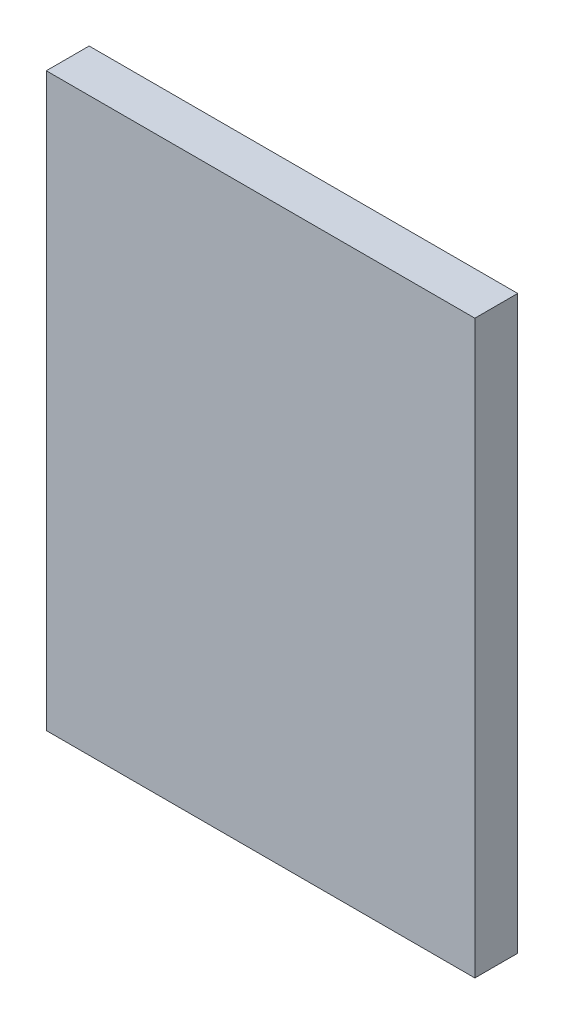
ISO-10303-21;
HEADER;
FILE_DESCRIPTION(('STEP AP214'),'2;1');
FILE_NAME('part.step','',(''),(''),'','','');
FILE_SCHEMA(('AUTOMOTIVE_DESIGN { 1 0 10303 214 1 1 1 1 }'));
ENDSEC;
DATA;
#1=APPLICATION_CONTEXT('core data for automotive mechanical design processes');
#2=APPLICATION_PROTOCOL_DEFINITION('international standard','automotive_design',2000,#1);
#3=PRODUCT_CONTEXT('',#1,'mechanical');
#4=PRODUCT('Part','Part','',(#3));
#5=PRODUCT_RELATED_PRODUCT_CATEGORY('part','',(#4));
#6=PRODUCT_DEFINITION_FORMATION('','',#4);
#7=PRODUCT_DEFINITION_CONTEXT('part definition',#1,'design');
#8=PRODUCT_DEFINITION('design','',#6,#7);
#9=PRODUCT_DEFINITION_SHAPE('','',#8);
#10=(LENGTH_UNIT() NAMED_UNIT(*) SI_UNIT(.MILLI.,.METRE.));
#11=(NAMED_UNIT(*) PLANE_ANGLE_UNIT() SI_UNIT($,.RADIAN.));
#12=(NAMED_UNIT(*) SI_UNIT($,.STERADIAN.) SOLID_ANGLE_UNIT());
#13=UNCERTAINTY_MEASURE_WITH_UNIT(LENGTH_MEASURE(1.E-05),#10,'distance_accuracy_value','');
#14=(GEOMETRIC_REPRESENTATION_CONTEXT(3) GLOBAL_UNCERTAINTY_ASSIGNED_CONTEXT((#13)) GLOBAL_UNIT_ASSIGNED_CONTEXT((#10,
#11,#12)) REPRESENTATION_CONTEXT('',''));
#15=CARTESIAN_POINT('',(0.,0.,0.));
#16=DIRECTION('',(0.,0.,1.));
#17=DIRECTION('',(1.,0.,0.));
#18=AXIS2_PLACEMENT_3D('',#15,#16,#17);
#19=CARTESIAN_POINT('',(0.,0.,30.));
#20=DIRECTION('',(1.,0.,0.));
#21=DIRECTION('',(0.,1.,0.));
#22=AXIS2_PLACEMENT_3D('',#19,#20,#21);
#23=PLANE('',#22);
#24=DIRECTION('',(0.,-1.,0.));
#25=VECTOR('',#24,1.);
#26=CARTESIAN_POINT('',(0.,0.,0.));
#27=LINE('',#26,#25);
#28=CARTESIAN_POINT('',(0.,0.,0.));
#29=VERTEX_POINT('',#28);
#30=CARTESIAN_POINT('',(0.,-400.,0.));
#31=VERTEX_POINT('',#30);
#32=EDGE_CURVE('E96',#29,#31,#27,.T.);
#33=ORIENTED_EDGE('',*,*,#32,.T.);
#34=DIRECTION('',(0.,0.,-1.));
#35=VECTOR('',#34,1.);
#36=CARTESIAN_POINT('',(0.,-400.,30.));
#37=LINE('',#36,#35);
#38=CARTESIAN_POINT('',(0.,-400.,30.));
#39=VERTEX_POINT('',#38);
#40=EDGE_CURVE('E11',#39,#31,#37,.T.);
#41=ORIENTED_EDGE('',*,*,#40,.F.);
#42=DIRECTION('',(0.,-1.,0.));
#43=VECTOR('',#42,1.);
#44=CARTESIAN_POINT('',(0.,0.,30.));
#45=LINE('',#44,#43);
#46=CARTESIAN_POINT('',(0.,0.,30.));
#47=VERTEX_POINT('',#46);
#48=EDGE_CURVE('E84',#47,#39,#45,.T.);
#49=ORIENTED_EDGE('',*,*,#48,.F.);
#50=DIRECTION('',(0.,0.,-1.));
#51=VECTOR('',#50,1.);
#52=CARTESIAN_POINT('',(0.,0.,30.));
#53=LINE('',#52,#51);
#54=EDGE_CURVE('E92',#47,#29,#53,.T.);
#55=ORIENTED_EDGE('',*,*,#54,.T.);
#56=EDGE_LOOP('',(#33,#41,#49,#55));
#57=FACE_BOUND('',#56,.T.);
#58=ADVANCED_FACE('F33',(#57),#23,.F.);
#59=CARTESIAN_POINT('',(0.,-400.,30.));
#60=DIRECTION('',(0.,1.,0.));
#61=DIRECTION('',(0.,0.,1.));
#62=AXIS2_PLACEMENT_3D('',#59,#60,#61);
#63=PLANE('',#62);
#64=DIRECTION('',(1.,0.,0.));
#65=VECTOR('',#64,1.);
#66=CARTESIAN_POINT('',(0.,-400.,0.));
#67=LINE('',#66,#65);
#68=CARTESIAN_POINT('',(300.,-400.,0.));
#69=VERTEX_POINT('',#68);
#70=EDGE_CURVE('E88',#31,#69,#67,.T.);
#71=ORIENTED_EDGE('',*,*,#70,.T.);
#72=DIRECTION('',(0.,0.,-1.));
#73=VECTOR('',#72,1.);
#74=CARTESIAN_POINT('',(300.,-400.,30.));
#75=LINE('',#74,#73);
#76=CARTESIAN_POINT('',(300.,-400.,30.));
#77=VERTEX_POINT('',#76);
#78=EDGE_CURVE('E41',#77,#69,#75,.T.);
#79=ORIENTED_EDGE('',*,*,#78,.F.);
#80=DIRECTION('',(1.,0.,0.));
#81=VECTOR('',#80,1.);
#82=CARTESIAN_POINT('',(0.,-400.,30.));
#83=LINE('',#82,#81);
#84=EDGE_CURVE('E79',#39,#77,#83,.T.);
#85=ORIENTED_EDGE('',*,*,#84,.F.);
#86=ORIENTED_EDGE('',*,*,#40,.T.);
#87=EDGE_LOOP('',(#71,#79,#85,#86));
#88=FACE_BOUND('',#87,.T.);
#89=ADVANCED_FACE('F87',(#88),#63,.F.);
#90=CARTESIAN_POINT('',(300.,0.,30.));
#91=DIRECTION('',(-1.,0.,0.));
#92=DIRECTION('',(0.,-1.,0.));
#93=AXIS2_PLACEMENT_3D('',#90,#91,#92);
#94=PLANE('',#93);
#95=DIRECTION('',(0.,1.,0.));
#96=VECTOR('',#95,1.);
#97=CARTESIAN_POINT('',(300.,0.,0.));
#98=LINE('',#97,#96);
#99=CARTESIAN_POINT('',(300.,0.,0.));
#100=VERTEX_POINT('',#99);
#101=EDGE_CURVE('E66',#69,#100,#98,.T.);
#102=ORIENTED_EDGE('',*,*,#101,.T.);
#103=DIRECTION('',(0.,0.,-1.));
#104=VECTOR('',#103,1.);
#105=CARTESIAN_POINT('',(300.,0.,30.));
#106=LINE('',#105,#104);
#107=CARTESIAN_POINT('',(300.,0.,30.));
#108=VERTEX_POINT('',#107);
#109=EDGE_CURVE('E89',#108,#100,#106,.T.);
#110=ORIENTED_EDGE('',*,*,#109,.F.);
#111=DIRECTION('',(0.,1.,0.));
#112=VECTOR('',#111,1.);
#113=CARTESIAN_POINT('',(300.,0.,30.));
#114=LINE('',#113,#112);
#115=EDGE_CURVE('E82',#77,#108,#114,.T.);
#116=ORIENTED_EDGE('',*,*,#115,.F.);
#117=ORIENTED_EDGE('',*,*,#78,.T.);
#118=EDGE_LOOP('',(#102,#110,#116,#117));
#119=FACE_BOUND('',#118,.T.);
#120=ADVANCED_FACE('F90',(#119),#94,.F.);
#121=CARTESIAN_POINT('',(0.,0.,30.));
#122=DIRECTION('',(0.,-1.,0.));
#123=DIRECTION('',(0.,0.,-1.));
#124=AXIS2_PLACEMENT_3D('',#121,#122,#123);
#125=PLANE('',#124);
#126=DIRECTION('',(-1.,0.,0.));
#127=VECTOR('',#126,1.);
#128=CARTESIAN_POINT('',(0.,0.,0.));
#129=LINE('',#128,#127);
#130=EDGE_CURVE('E72',#100,#29,#129,.T.);
#131=ORIENTED_EDGE('',*,*,#130,.T.);
#132=ORIENTED_EDGE('',*,*,#54,.F.);
#133=DIRECTION('',(-1.,0.,0.));
#134=VECTOR('',#133,1.);
#135=CARTESIAN_POINT('',(0.,0.,30.));
#136=LINE('',#135,#134);
#137=EDGE_CURVE('E49',#108,#47,#136,.T.);
#138=ORIENTED_EDGE('',*,*,#137,.F.);
#139=ORIENTED_EDGE('',*,*,#109,.T.);
#140=EDGE_LOOP('',(#131,#132,#138,#139));
#141=FACE_BOUND('',#140,.T.);
#142=ADVANCED_FACE('F103',(#141),#125,.F.);
#143=CARTESIAN_POINT('',(0.,0.,30.));
#144=DIRECTION('',(0.,0.,1.));
#145=DIRECTION('',(1.,0.,0.));
#146=AXIS2_PLACEMENT_3D('',#143,#144,#145);
#147=PLANE('',#146);
#148=ORIENTED_EDGE('',*,*,#48,.T.);
#149=ORIENTED_EDGE('',*,*,#84,.T.);
#150=ORIENTED_EDGE('',*,*,#115,.T.);
#151=ORIENTED_EDGE('',*,*,#137,.T.);
#152=EDGE_LOOP('',(#148,#149,#150,#151));
#153=FACE_BOUND('',#152,.T.);
#154=ADVANCED_FACE('F80',(#153),#147,.T.);
#155=CARTESIAN_POINT('',(0.,0.,0.));
#156=DIRECTION('',(0.,0.,1.));
#157=DIRECTION('',(1.,0.,0.));
#158=AXIS2_PLACEMENT_3D('',#155,#156,#157);
#159=PLANE('',#158);
#160=ORIENTED_EDGE('',*,*,#32,.F.);
#161=ORIENTED_EDGE('',*,*,#130,.F.);
#162=ORIENTED_EDGE('',*,*,#101,.F.);
#163=ORIENTED_EDGE('',*,*,#70,.F.);
#164=EDGE_LOOP('',(#160,#161,#162,#163));
#165=FACE_BOUND('',#164,.T.);
#166=ADVANCED_FACE('F106',(#165),#159,.F.);
#167=CLOSED_SHELL('',(#58,#89,#120,#142,#154,#166));
#168=MANIFOLD_SOLID_BREP('B2',#167);
#169=ADVANCED_BREP_SHAPE_REPRESENTATION('',(#18,#168),#14);
#170=SHAPE_DEFINITION_REPRESENTATION(#9,#169);
ENDSEC;
END-ISO-10303-21;
